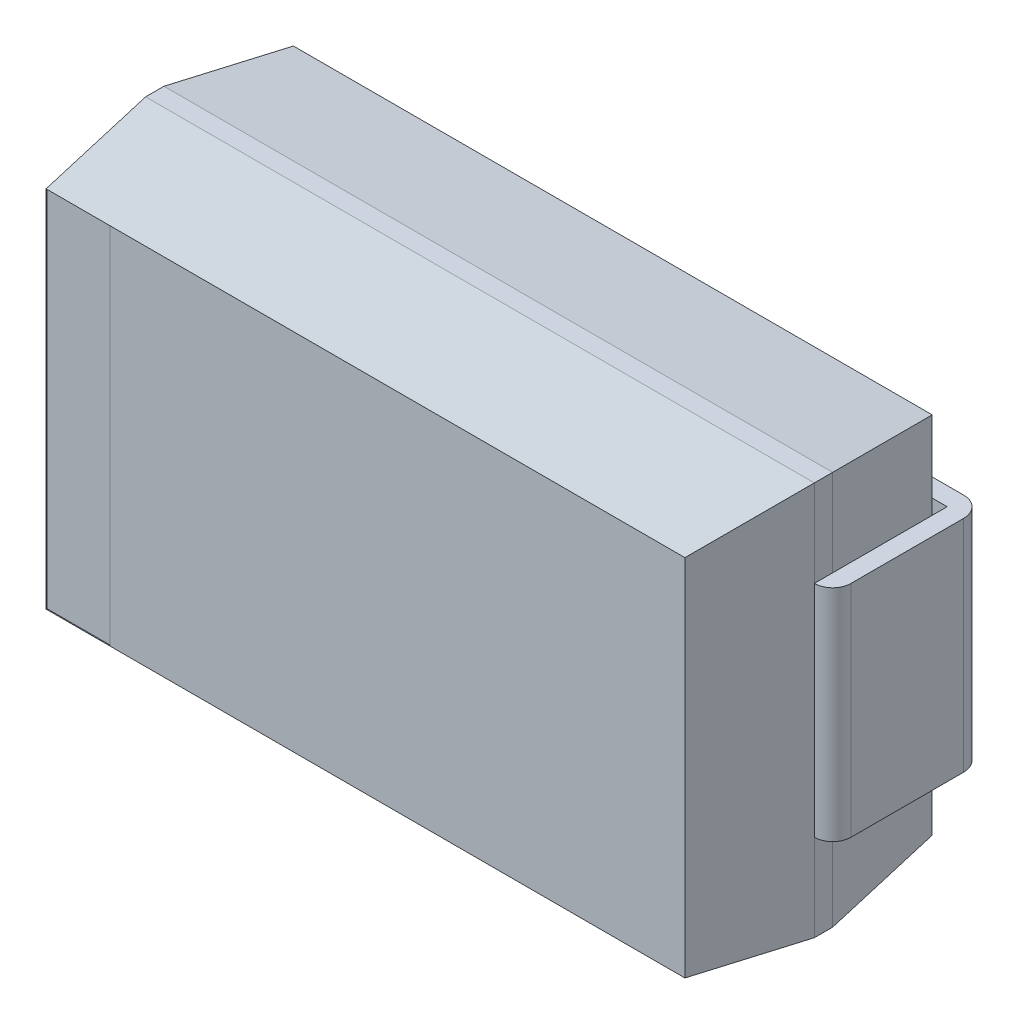
ISO-10303-21;
HEADER;
FILE_DESCRIPTION(('STEP AP214'),'2;1');
FILE_NAME('part.step','',(''),(''),'','','');
FILE_SCHEMA(('AUTOMOTIVE_DESIGN { 1 0 10303 214 1 1 1 1 }'));
ENDSEC;
DATA;
#1=APPLICATION_CONTEXT('core data for automotive mechanical design processes');
#2=APPLICATION_PROTOCOL_DEFINITION('international standard','automotive_design',2000,#1);
#3=PRODUCT_CONTEXT('',#1,'mechanical');
#4=PRODUCT('Part','Part','',(#3));
#5=PRODUCT_RELATED_PRODUCT_CATEGORY('part','',(#4));
#6=PRODUCT_DEFINITION_FORMATION('','',#4);
#7=PRODUCT_DEFINITION_CONTEXT('part definition',#1,'design');
#8=PRODUCT_DEFINITION('design','',#6,#7);
#9=PRODUCT_DEFINITION_SHAPE('','',#8);
#10=(LENGTH_UNIT() NAMED_UNIT(*) SI_UNIT(.MILLI.,.METRE.));
#11=(NAMED_UNIT(*) PLANE_ANGLE_UNIT() SI_UNIT($,.RADIAN.));
#12=(NAMED_UNIT(*) SI_UNIT($,.STERADIAN.) SOLID_ANGLE_UNIT());
#13=UNCERTAINTY_MEASURE_WITH_UNIT(LENGTH_MEASURE(1.E-05),#10,'distance_accuracy_value','');
#14=(GEOMETRIC_REPRESENTATION_CONTEXT(3) GLOBAL_UNCERTAINTY_ASSIGNED_CONTEXT((#13)) GLOBAL_UNIT_ASSIGNED_CONTEXT((#10,
#11,#12)) REPRESENTATION_CONTEXT('',''));
#15=CARTESIAN_POINT('',(0.,0.,0.));
#16=DIRECTION('',(0.,0.,1.));
#17=DIRECTION('',(1.,0.,0.));
#18=AXIS2_PLACEMENT_3D('',#15,#16,#17);
#19=CARTESIAN_POINT('',(2.55,-1.2,0.));
#20=DIRECTION('',(-1.,0.,0.));
#21=DIRECTION('',(0.,0.,-1.));
#22=AXIS2_PLACEMENT_3D('',#19,#20,#21);
#23=PLANE('',#22);
#24=DIRECTION('',(0.,1.,0.));
#25=VECTOR('',#24,1.);
#26=CARTESIAN_POINT('',(2.55,-1.2,0.));
#27=LINE('',#26,#25);
#28=CARTESIAN_POINT('',(2.55,-1.2,0.));
#29=VERTEX_POINT('',#28);
#30=CARTESIAN_POINT('',(2.55,1.2,0.));
#31=VERTEX_POINT('',#30);
#32=EDGE_CURVE('E53',#29,#31,#27,.T.);
#33=ORIENTED_EDGE('',*,*,#32,.F.);
#34=DIRECTION('',(0.,0.,-1.));
#35=VECTOR('',#34,1.);
#36=CARTESIAN_POINT('',(2.55,-1.2,0.));
#37=LINE('',#36,#35);
#38=CARTESIAN_POINT('',(2.55,-1.2,0.2));
#39=VERTEX_POINT('',#38);
#40=EDGE_CURVE('E166',#39,#29,#37,.T.);
#41=ORIENTED_EDGE('',*,*,#40,.F.);
#42=DIRECTION('',(0.,1.,0.));
#43=VECTOR('',#42,1.);
#44=CARTESIAN_POINT('',(2.55,-1.2,0.2));
#45=LINE('',#44,#43);
#46=CARTESIAN_POINT('',(2.55,1.2,0.2));
#47=VERTEX_POINT('',#46);
#48=EDGE_CURVE('E12',#39,#47,#45,.T.);
#49=ORIENTED_EDGE('',*,*,#48,.T.);
#50=DIRECTION('',(0.,0.,-1.));
#51=VECTOR('',#50,1.);
#52=CARTESIAN_POINT('',(2.55,1.2,0.));
#53=LINE('',#52,#51);
#54=EDGE_CURVE('E114',#47,#31,#53,.T.);
#55=ORIENTED_EDGE('',*,*,#54,.T.);
#56=EDGE_LOOP('',(#33,#41,#49,#55));
#57=FACE_BOUND('',#56,.T.);
#58=ADVANCED_FACE('F50',(#57),#23,.T.);
#59=CARTESIAN_POINT('',(2.55,-1.2,0.2));
#60=DIRECTION('',(0.,0.,1.));
#61=DIRECTION('',(-1.,0.,0.));
#62=AXIS2_PLACEMENT_3D('',#59,#60,#61);
#63=PLANE('',#62);
#64=ORIENTED_EDGE('',*,*,#48,.F.);
#65=DIRECTION('',(-1.,0.,0.));
#66=VECTOR('',#65,1.);
#67=CARTESIAN_POINT('',(2.55,-1.2,0.2));
#68=LINE('',#67,#66);
#69=CARTESIAN_POINT('',(3.65,-1.2,0.2));
#70=VERTEX_POINT('',#69);
#71=EDGE_CURVE('E66',#70,#39,#68,.T.);
#72=ORIENTED_EDGE('',*,*,#71,.F.);
#73=DIRECTION('',(0.,1.,0.));
#74=VECTOR('',#73,1.);
#75=CARTESIAN_POINT('',(3.65,-1.2,0.2));
#76=LINE('',#75,#74);
#77=CARTESIAN_POINT('',(3.65,1.2,0.2));
#78=VERTEX_POINT('',#77);
#79=EDGE_CURVE('E58',#70,#78,#76,.T.);
#80=ORIENTED_EDGE('',*,*,#79,.T.);
#81=DIRECTION('',(-1.,0.,0.));
#82=VECTOR('',#81,1.);
#83=CARTESIAN_POINT('',(2.55,1.2,0.2));
#84=LINE('',#83,#82);
#85=EDGE_CURVE('E164',#78,#47,#84,.T.);
#86=ORIENTED_EDGE('',*,*,#85,.T.);
#87=EDGE_LOOP('',(#64,#72,#80,#86));
#88=FACE_BOUND('',#87,.T.);
#89=ADVANCED_FACE('F178',(#88),#63,.T.);
#90=CARTESIAN_POINT('',(3.65,-1.2,0.2));
#91=DIRECTION('',(-1.,0.,0.));
#92=DIRECTION('',(0.,0.,-1.));
#93=AXIS2_PLACEMENT_3D('',#90,#91,#92);
#94=PLANE('',#93);
#95=ORIENTED_EDGE('',*,*,#79,.F.);
#96=DIRECTION('',(0.,0.,-1.));
#97=VECTOR('',#96,1.);
#98=CARTESIAN_POINT('',(3.65,-1.2,1.45000000000003));
#99=LINE('',#98,#97);
#100=CARTESIAN_POINT('',(3.65,-1.2,1.65000000000003));
#101=VERTEX_POINT('',#100);
#102=EDGE_CURVE('E71',#101,#70,#99,.T.);
#103=ORIENTED_EDGE('',*,*,#102,.F.);
#104=DIRECTION('',(0.,1.,0.));
#105=VECTOR('',#104,1.);
#106=CARTESIAN_POINT('',(3.65,-1.2,1.65000000000003));
#107=LINE('',#106,#105);
#108=CARTESIAN_POINT('',(3.65,1.2,1.65000000000003));
#109=VERTEX_POINT('',#108);
#110=EDGE_CURVE('E137',#101,#109,#107,.T.);
#111=ORIENTED_EDGE('',*,*,#110,.T.);
#112=DIRECTION('',(0.,0.,-1.));
#113=VECTOR('',#112,1.);
#114=CARTESIAN_POINT('',(3.65,1.2,1.45000000000003));
#115=LINE('',#114,#113);
#116=EDGE_CURVE('E160',#109,#78,#115,.T.);
#117=ORIENTED_EDGE('',*,*,#116,.T.);
#118=EDGE_LOOP('',(#95,#103,#111,#117));
#119=FACE_BOUND('',#118,.T.);
#120=ADVANCED_FACE('F176',(#119),#94,.T.);
#121=CARTESIAN_POINT('',(3.65,-1.2,1.45000000000003));
#122=DIRECTION('',(0.,1.,0.));
#123=DIRECTION('',(0.,0.,1.));
#124=AXIS2_PLACEMENT_3D('',#121,#122,#123);
#125=CYLINDRICAL_SURFACE('',#124,0.2);
#126=ORIENTED_EDGE('',*,*,#110,.F.);
#127=CARTESIAN_POINT('',(3.65,-1.2,1.45000000000003));
#128=DIRECTION('',(0.,-1.,0.));
#129=DIRECTION('',(0.,0.,-1.));
#130=AXIS2_PLACEMENT_3D('',#127,#128,#129);
#131=CIRCLE('',#130,0.2);
#132=CARTESIAN_POINT('',(3.85,-1.2,1.45000000000003));
#133=VERTEX_POINT('',#132);
#134=EDGE_CURVE('E131',#133,#101,#131,.T.);
#135=ORIENTED_EDGE('',*,*,#134,.F.);
#136=DIRECTION('',(0.,1.,0.));
#137=VECTOR('',#136,1.);
#138=CARTESIAN_POINT('',(3.85,-1.2,1.45000000000003));
#139=LINE('',#138,#137);
#140=CARTESIAN_POINT('',(3.85,1.2,1.45000000000003));
#141=VERTEX_POINT('',#140);
#142=EDGE_CURVE('E140',#133,#141,#139,.T.);
#143=ORIENTED_EDGE('',*,*,#142,.T.);
#144=CARTESIAN_POINT('',(3.65,1.2,1.45000000000003));
#145=DIRECTION('',(0.,-1.,0.));
#146=DIRECTION('',(0.,0.,-1.));
#147=AXIS2_PLACEMENT_3D('',#144,#145,#146);
#148=CIRCLE('',#147,0.2);
#149=EDGE_CURVE('E158',#141,#109,#148,.T.);
#150=ORIENTED_EDGE('',*,*,#149,.T.);
#151=EDGE_LOOP('',(#126,#135,#143,#150));
#152=FACE_BOUND('',#151,.T.);
#153=ADVANCED_FACE('F174',(#152),#125,.T.);
#154=CARTESIAN_POINT('',(3.85,-1.2,1.45000000000003));
#155=DIRECTION('',(1.,0.,0.));
#156=DIRECTION('',(0.,0.,1.));
#157=AXIS2_PLACEMENT_3D('',#154,#155,#156);
#158=PLANE('',#157);
#159=ORIENTED_EDGE('',*,*,#142,.F.);
#160=DIRECTION('',(0.,0.,1.));
#161=VECTOR('',#160,1.);
#162=CARTESIAN_POINT('',(3.85,-1.2,1.45000000000003));
#163=LINE('',#162,#161);
#164=CARTESIAN_POINT('',(3.85,-1.2,0.22));
#165=VERTEX_POINT('',#164);
#166=EDGE_CURVE('E151',#165,#133,#163,.T.);
#167=ORIENTED_EDGE('',*,*,#166,.F.);
#168=DIRECTION('',(0.,1.,0.));
#169=VECTOR('',#168,1.);
#170=CARTESIAN_POINT('',(3.85,-1.2,0.22));
#171=LINE('',#170,#169);
#172=CARTESIAN_POINT('',(3.85,1.2,0.22));
#173=VERTEX_POINT('',#172);
#174=EDGE_CURVE('E129',#165,#173,#171,.T.);
#175=ORIENTED_EDGE('',*,*,#174,.T.);
#176=DIRECTION('',(0.,0.,1.));
#177=VECTOR('',#176,1.);
#178=CARTESIAN_POINT('',(3.85,1.2,1.45000000000003));
#179=LINE('',#178,#177);
#180=EDGE_CURVE('E149',#173,#141,#179,.T.);
#181=ORIENTED_EDGE('',*,*,#180,.T.);
#182=EDGE_LOOP('',(#159,#167,#175,#181));
#183=FACE_BOUND('',#182,.T.);
#184=ADVANCED_FACE('F148',(#183),#158,.T.);
#185=CARTESIAN_POINT('',(3.63,-1.2,0.22));
#186=DIRECTION('',(0.,1.,0.));
#187=DIRECTION('',(0.,0.,1.));
#188=AXIS2_PLACEMENT_3D('',#185,#186,#187);
#189=CYLINDRICAL_SURFACE('',#188,0.22);
#190=ORIENTED_EDGE('',*,*,#174,.F.);
#191=CARTESIAN_POINT('',(3.63,-1.2,0.22));
#192=DIRECTION('',(0.,-1.,0.));
#193=DIRECTION('',(0.,0.,1.));
#194=AXIS2_PLACEMENT_3D('',#191,#192,#193);
#195=CIRCLE('',#194,0.22);
#196=CARTESIAN_POINT('',(3.63,-1.2,0.));
#197=VERTEX_POINT('',#196);
#198=EDGE_CURVE('E155',#197,#165,#195,.T.);
#199=ORIENTED_EDGE('',*,*,#198,.F.);
#200=DIRECTION('',(0.,1.,0.));
#201=VECTOR('',#200,1.);
#202=CARTESIAN_POINT('',(3.63,-1.2,0.));
#203=LINE('',#202,#201);
#204=CARTESIAN_POINT('',(3.63,1.2,0.));
#205=VERTEX_POINT('',#204);
#206=EDGE_CURVE('E128',#197,#205,#203,.T.);
#207=ORIENTED_EDGE('',*,*,#206,.T.);
#208=CARTESIAN_POINT('',(3.63,1.2,0.22));
#209=DIRECTION('',(0.,-1.,0.));
#210=DIRECTION('',(0.,0.,1.));
#211=AXIS2_PLACEMENT_3D('',#208,#209,#210);
#212=CIRCLE('',#211,0.22);
#213=EDGE_CURVE('E116',#205,#173,#212,.T.);
#214=ORIENTED_EDGE('',*,*,#213,.T.);
#215=EDGE_LOOP('',(#190,#199,#207,#214));
#216=FACE_BOUND('',#215,.T.);
#217=ADVANCED_FACE('F154',(#216),#189,.T.);
#218=CARTESIAN_POINT('',(2.55,-1.2,0.));
#219=DIRECTION('',(0.,0.,-1.));
#220=DIRECTION('',(1.,0.,0.));
#221=AXIS2_PLACEMENT_3D('',#218,#219,#220);
#222=PLANE('',#221);
#223=ORIENTED_EDGE('',*,*,#206,.F.);
#224=DIRECTION('',(1.,0.,0.));
#225=VECTOR('',#224,1.);
#226=CARTESIAN_POINT('',(2.55,-1.2,0.));
#227=LINE('',#226,#225);
#228=EDGE_CURVE('E127',#29,#197,#227,.T.);
#229=ORIENTED_EDGE('',*,*,#228,.F.);
#230=ORIENTED_EDGE('',*,*,#32,.T.);
#231=DIRECTION('',(1.,0.,0.));
#232=VECTOR('',#231,1.);
#233=CARTESIAN_POINT('',(2.55,1.2,0.));
#234=LINE('',#233,#232);
#235=EDGE_CURVE('E110',#31,#205,#234,.T.);
#236=ORIENTED_EDGE('',*,*,#235,.T.);
#237=EDGE_LOOP('',(#223,#229,#230,#236));
#238=FACE_BOUND('',#237,.T.);
#239=ADVANCED_FACE('F126',(#238),#222,.T.);
#240=CARTESIAN_POINT('',(3.65,-1.2,1.45000000000003));
#241=DIRECTION('',(0.,-1.,0.));
#242=DIRECTION('',(0.,0.,-1.));
#243=AXIS2_PLACEMENT_3D('',#240,#241,#242);
#244=PLANE('',#243);
#245=ORIENTED_EDGE('',*,*,#40,.T.);
#246=ORIENTED_EDGE('',*,*,#228,.T.);
#247=ORIENTED_EDGE('',*,*,#198,.T.);
#248=ORIENTED_EDGE('',*,*,#166,.T.);
#249=ORIENTED_EDGE('',*,*,#134,.T.);
#250=ORIENTED_EDGE('',*,*,#102,.T.);
#251=ORIENTED_EDGE('',*,*,#71,.T.);
#252=EDGE_LOOP('',(#245,#246,#247,#248,#249,#250,#251));
#253=FACE_BOUND('',#252,.T.);
#254=ADVANCED_FACE('F172',(#253),#244,.T.);
#255=CARTESIAN_POINT('',(3.65,1.2,1.45000000000003));
#256=DIRECTION('',(0.,-1.,0.));
#257=DIRECTION('',(0.,0.,-1.));
#258=AXIS2_PLACEMENT_3D('',#255,#256,#257);
#259=PLANE('',#258);
#260=ORIENTED_EDGE('',*,*,#54,.F.);
#261=ORIENTED_EDGE('',*,*,#85,.F.);
#262=ORIENTED_EDGE('',*,*,#116,.F.);
#263=ORIENTED_EDGE('',*,*,#149,.F.);
#264=ORIENTED_EDGE('',*,*,#180,.F.);
#265=ORIENTED_EDGE('',*,*,#213,.F.);
#266=ORIENTED_EDGE('',*,*,#235,.F.);
#267=EDGE_LOOP('',(#260,#261,#262,#263,#264,#265,#266));
#268=FACE_BOUND('',#267,.T.);
#269=ADVANCED_FACE('F112',(#268),#259,.F.);
#270=CLOSED_SHELL('',(#58,#89,#120,#153,#184,#217,#239,#254,#269));
#271=MANIFOLD_SOLID_BREP('B2',#270);
#272=CARTESIAN_POINT('',(-2.55,-1.2,0.));
#273=DIRECTION('',(1.,0.,0.));
#274=DIRECTION('',(0.,0.,-1.));
#275=AXIS2_PLACEMENT_3D('',#272,#273,#274);
#276=PLANE('',#275);
#277=DIRECTION('',(0.,1.,0.));
#278=VECTOR('',#277,1.);
#279=CARTESIAN_POINT('',(-2.55,-1.2,0.));
#280=LINE('',#279,#278);
#281=CARTESIAN_POINT('',(-2.55,-1.2,0.));
#282=VERTEX_POINT('',#281);
#283=CARTESIAN_POINT('',(-2.55,1.2,0.));
#284=VERTEX_POINT('',#283);
#285=EDGE_CURVE('E285',#282,#284,#280,.T.);
#286=ORIENTED_EDGE('',*,*,#285,.T.);
#287=DIRECTION('',(0.,0.,-1.));
#288=VECTOR('',#287,1.);
#289=CARTESIAN_POINT('',(-2.55,1.2,0.));
#290=LINE('',#289,#288);
#291=CARTESIAN_POINT('',(-2.55,1.2,0.2));
#292=VERTEX_POINT('',#291);
#293=EDGE_CURVE('E340',#292,#284,#290,.T.);
#294=ORIENTED_EDGE('',*,*,#293,.F.);
#295=DIRECTION('',(0.,1.,0.));
#296=VECTOR('',#295,1.);
#297=CARTESIAN_POINT('',(-2.55,-1.2,0.2));
#298=LINE('',#297,#296);
#299=CARTESIAN_POINT('',(-2.55,-1.2,0.2));
#300=VERTEX_POINT('',#299);
#301=EDGE_CURVE('E48',#300,#292,#298,.T.);
#302=ORIENTED_EDGE('',*,*,#301,.F.);
#303=DIRECTION('',(0.,0.,-1.));
#304=VECTOR('',#303,1.);
#305=CARTESIAN_POINT('',(-2.55,-1.2,0.));
#306=LINE('',#305,#304);
#307=EDGE_CURVE('E341',#300,#282,#306,.T.);
#308=ORIENTED_EDGE('',*,*,#307,.T.);
#309=EDGE_LOOP('',(#286,#294,#302,#308));
#310=FACE_BOUND('',#309,.T.);
#311=ADVANCED_FACE('F282',(#310),#276,.T.);
#312=CARTESIAN_POINT('',(-2.55,-1.2,0.2));
#313=DIRECTION('',(0.,0.,1.));
#314=DIRECTION('',(1.,0.,0.));
#315=AXIS2_PLACEMENT_3D('',#312,#313,#314);
#316=PLANE('',#315);
#317=ORIENTED_EDGE('',*,*,#301,.T.);
#318=DIRECTION('',(1.,0.,0.));
#319=VECTOR('',#318,1.);
#320=CARTESIAN_POINT('',(-2.55,1.2,0.2));
#321=LINE('',#320,#319);
#322=CARTESIAN_POINT('',(-3.65,1.2,0.2));
#323=VERTEX_POINT('',#322);
#324=EDGE_CURVE('E359',#323,#292,#321,.T.);
#325=ORIENTED_EDGE('',*,*,#324,.F.);
#326=DIRECTION('',(0.,1.,0.));
#327=VECTOR('',#326,1.);
#328=CARTESIAN_POINT('',(-3.65,-1.2,0.2));
#329=LINE('',#328,#327);
#330=CARTESIAN_POINT('',(-3.65,-1.2,0.2));
#331=VERTEX_POINT('',#330);
#332=EDGE_CURVE('E290',#331,#323,#329,.T.);
#333=ORIENTED_EDGE('',*,*,#332,.F.);
#334=DIRECTION('',(1.,0.,0.));
#335=VECTOR('',#334,1.);
#336=CARTESIAN_POINT('',(-2.55,-1.2,0.2));
#337=LINE('',#336,#335);
#338=EDGE_CURVE('E346',#331,#300,#337,.T.);
#339=ORIENTED_EDGE('',*,*,#338,.T.);
#340=EDGE_LOOP('',(#317,#325,#333,#339));
#341=FACE_BOUND('',#340,.T.);
#342=ADVANCED_FACE('F408',(#341),#316,.T.);
#343=CARTESIAN_POINT('',(-3.65,-1.2,0.2));
#344=DIRECTION('',(1.,0.,0.));
#345=DIRECTION('',(0.,0.,-1.));
#346=AXIS2_PLACEMENT_3D('',#343,#344,#345);
#347=PLANE('',#346);
#348=ORIENTED_EDGE('',*,*,#332,.T.);
#349=DIRECTION('',(0.,0.,-1.));
#350=VECTOR('',#349,1.);
#351=CARTESIAN_POINT('',(-3.65,1.2,1.45000000000003));
#352=LINE('',#351,#350);
#353=CARTESIAN_POINT('',(-3.65,1.2,1.65000000000003));
#354=VERTEX_POINT('',#353);
#355=EDGE_CURVE('E369',#354,#323,#352,.T.);
#356=ORIENTED_EDGE('',*,*,#355,.F.);
#357=DIRECTION('',(0.,1.,0.));
#358=VECTOR('',#357,1.);
#359=CARTESIAN_POINT('',(-3.65,-1.2,1.65000000000003));
#360=LINE('',#359,#358);
#361=CARTESIAN_POINT('',(-3.65,-1.2,1.65000000000003));
#362=VERTEX_POINT('',#361);
#363=EDGE_CURVE('E388',#362,#354,#360,.T.);
#364=ORIENTED_EDGE('',*,*,#363,.F.);
#365=DIRECTION('',(0.,0.,-1.));
#366=VECTOR('',#365,1.);
#367=CARTESIAN_POINT('',(-3.65,-1.2,1.45000000000003));
#368=LINE('',#367,#366);
#369=EDGE_CURVE('E304',#362,#331,#368,.T.);
#370=ORIENTED_EDGE('',*,*,#369,.T.);
#371=EDGE_LOOP('',(#348,#356,#364,#370));
#372=FACE_BOUND('',#371,.T.);
#373=ADVANCED_FACE('F410',(#372),#347,.T.);
#374=CARTESIAN_POINT('',(-3.65,-1.2,1.45000000000003));
#375=DIRECTION('',(0.,1.,0.));
#376=DIRECTION('',(0.,0.,1.));
#377=AXIS2_PLACEMENT_3D('',#374,#375,#376);
#378=CYLINDRICAL_SURFACE('',#377,0.2);
#379=ORIENTED_EDGE('',*,*,#363,.T.);
#380=CARTESIAN_POINT('',(-3.65,1.2,1.45000000000003));
#381=DIRECTION('',(0.,1.,0.));
#382=DIRECTION('',(0.,0.,-1.));
#383=AXIS2_PLACEMENT_3D('',#380,#381,#382);
#384=CIRCLE('',#383,0.2);
#385=CARTESIAN_POINT('',(-3.85,1.2,1.45000000000003));
#386=VERTEX_POINT('',#385);
#387=EDGE_CURVE('E366',#386,#354,#384,.T.);
#388=ORIENTED_EDGE('',*,*,#387,.F.);
#389=DIRECTION('',(0.,1.,0.));
#390=VECTOR('',#389,1.);
#391=CARTESIAN_POINT('',(-3.85,-1.2,1.45000000000003));
#392=LINE('',#391,#390);
#393=CARTESIAN_POINT('',(-3.85,-1.2,1.45000000000003));
#394=VERTEX_POINT('',#393);
#395=EDGE_CURVE('E390',#394,#386,#392,.T.);
#396=ORIENTED_EDGE('',*,*,#395,.F.);
#397=CARTESIAN_POINT('',(-3.65,-1.2,1.45000000000003));
#398=DIRECTION('',(0.,1.,0.));
#399=DIRECTION('',(0.,0.,-1.));
#400=AXIS2_PLACEMENT_3D('',#397,#398,#399);
#401=CIRCLE('',#400,0.2);
#402=EDGE_CURVE('E381',#394,#362,#401,.T.);
#403=ORIENTED_EDGE('',*,*,#402,.T.);
#404=EDGE_LOOP('',(#379,#388,#396,#403));
#405=FACE_BOUND('',#404,.T.);
#406=ADVANCED_FACE('F403',(#405),#378,.T.);
#407=CARTESIAN_POINT('',(-3.85,-1.2,1.45000000000003));
#408=DIRECTION('',(-1.,0.,0.));
#409=DIRECTION('',(0.,0.,1.));
#410=AXIS2_PLACEMENT_3D('',#407,#408,#409);
#411=PLANE('',#410);
#412=ORIENTED_EDGE('',*,*,#395,.T.);
#413=DIRECTION('',(0.,0.,1.));
#414=VECTOR('',#413,1.);
#415=CARTESIAN_POINT('',(-3.85,1.2,1.45000000000003));
#416=LINE('',#415,#414);
#417=CARTESIAN_POINT('',(-3.85,1.2,0.22));
#418=VERTEX_POINT('',#417);
#419=EDGE_CURVE('E363',#418,#386,#416,.T.);
#420=ORIENTED_EDGE('',*,*,#419,.F.);
#421=DIRECTION('',(0.,1.,0.));
#422=VECTOR('',#421,1.);
#423=CARTESIAN_POINT('',(-3.85,-1.2,0.22));
#424=LINE('',#423,#422);
#425=CARTESIAN_POINT('',(-3.85,-1.2,0.22));
#426=VERTEX_POINT('',#425);
#427=EDGE_CURVE('E392',#426,#418,#424,.T.);
#428=ORIENTED_EDGE('',*,*,#427,.F.);
#429=DIRECTION('',(0.,0.,1.));
#430=VECTOR('',#429,1.);
#431=CARTESIAN_POINT('',(-3.85,-1.2,1.45000000000003));
#432=LINE('',#431,#430);
#433=EDGE_CURVE('E378',#426,#394,#432,.T.);
#434=ORIENTED_EDGE('',*,*,#433,.T.);
#435=EDGE_LOOP('',(#412,#420,#428,#434));
#436=FACE_BOUND('',#435,.T.);
#437=ADVANCED_FACE('F400',(#436),#411,.T.);
#438=CARTESIAN_POINT('',(-3.63,-1.2,0.22));
#439=DIRECTION('',(0.,1.,0.));
#440=DIRECTION('',(0.,0.,1.));
#441=AXIS2_PLACEMENT_3D('',#438,#439,#440);
#442=CYLINDRICAL_SURFACE('',#441,0.22);
#443=ORIENTED_EDGE('',*,*,#427,.T.);
#444=CARTESIAN_POINT('',(-3.63,1.2,0.22));
#445=DIRECTION('',(0.,1.,0.));
#446=DIRECTION('',(0.,0.,1.));
#447=AXIS2_PLACEMENT_3D('',#444,#445,#446);
#448=CIRCLE('',#447,0.22);
#449=CARTESIAN_POINT('',(-3.63,1.2,0.));
#450=VERTEX_POINT('',#449);
#451=EDGE_CURVE('E353',#450,#418,#448,.T.);
#452=ORIENTED_EDGE('',*,*,#451,.F.);
#453=DIRECTION('',(0.,1.,0.));
#454=VECTOR('',#453,1.);
#455=CARTESIAN_POINT('',(-3.63,-1.2,0.));
#456=LINE('',#455,#454);
#457=CARTESIAN_POINT('',(-3.63,-1.2,0.));
#458=VERTEX_POINT('',#457);
#459=EDGE_CURVE('E345',#458,#450,#456,.T.);
#460=ORIENTED_EDGE('',*,*,#459,.F.);
#461=CARTESIAN_POINT('',(-3.63,-1.2,0.22));
#462=DIRECTION('',(0.,1.,0.));
#463=DIRECTION('',(0.,0.,1.));
#464=AXIS2_PLACEMENT_3D('',#461,#462,#463);
#465=CIRCLE('',#464,0.22);
#466=EDGE_CURVE('E375',#458,#426,#465,.T.);
#467=ORIENTED_EDGE('',*,*,#466,.T.);
#468=EDGE_LOOP('',(#443,#452,#460,#467));
#469=FACE_BOUND('',#468,.T.);
#470=ADVANCED_FACE('F394',(#469),#442,.T.);
#471=CARTESIAN_POINT('',(-2.55,-1.2,0.));
#472=DIRECTION('',(0.,0.,-1.));
#473=DIRECTION('',(-1.,0.,0.));
#474=AXIS2_PLACEMENT_3D('',#471,#472,#473);
#475=PLANE('',#474);
#476=ORIENTED_EDGE('',*,*,#459,.T.);
#477=DIRECTION('',(-1.,0.,0.));
#478=VECTOR('',#477,1.);
#479=CARTESIAN_POINT('',(-2.55,1.2,0.));
#480=LINE('',#479,#478);
#481=EDGE_CURVE('E348',#284,#450,#480,.T.);
#482=ORIENTED_EDGE('',*,*,#481,.F.);
#483=ORIENTED_EDGE('',*,*,#285,.F.);
#484=DIRECTION('',(-1.,0.,0.));
#485=VECTOR('',#484,1.);
#486=CARTESIAN_POINT('',(-2.55,-1.2,0.));
#487=LINE('',#486,#485);
#488=EDGE_CURVE('E373',#282,#458,#487,.T.);
#489=ORIENTED_EDGE('',*,*,#488,.T.);
#490=EDGE_LOOP('',(#476,#482,#483,#489));
#491=FACE_BOUND('',#490,.T.);
#492=ADVANCED_FACE('F349',(#491),#475,.T.);
#493=CARTESIAN_POINT('',(-3.65,-1.2,1.45000000000003));
#494=DIRECTION('',(0.,-1.,0.));
#495=DIRECTION('',(0.,0.,-1.));
#496=AXIS2_PLACEMENT_3D('',#493,#494,#495);
#497=PLANE('',#496);
#498=ORIENTED_EDGE('',*,*,#307,.F.);
#499=ORIENTED_EDGE('',*,*,#338,.F.);
#500=ORIENTED_EDGE('',*,*,#369,.F.);
#501=ORIENTED_EDGE('',*,*,#402,.F.);
#502=ORIENTED_EDGE('',*,*,#433,.F.);
#503=ORIENTED_EDGE('',*,*,#466,.F.);
#504=ORIENTED_EDGE('',*,*,#488,.F.);
#505=EDGE_LOOP('',(#498,#499,#500,#501,#502,#503,#504));
#506=FACE_BOUND('',#505,.T.);
#507=ADVANCED_FACE('F405',(#506),#497,.T.);
#508=CARTESIAN_POINT('',(-3.65,1.2,1.45000000000003));
#509=DIRECTION('',(0.,-1.,0.));
#510=DIRECTION('',(0.,0.,-1.));
#511=AXIS2_PLACEMENT_3D('',#508,#509,#510);
#512=PLANE('',#511);
#513=ORIENTED_EDGE('',*,*,#293,.T.);
#514=ORIENTED_EDGE('',*,*,#481,.T.);
#515=ORIENTED_EDGE('',*,*,#451,.T.);
#516=ORIENTED_EDGE('',*,*,#419,.T.);
#517=ORIENTED_EDGE('',*,*,#387,.T.);
#518=ORIENTED_EDGE('',*,*,#355,.T.);
#519=ORIENTED_EDGE('',*,*,#324,.T.);
#520=EDGE_LOOP('',(#513,#514,#515,#516,#517,#518,#519));
#521=FACE_BOUND('',#520,.T.);
#522=ADVANCED_FACE('F356',(#521),#512,.F.);
#523=CLOSED_SHELL('',(#311,#342,#373,#406,#437,#470,#492,#507,#522));
#524=MANIFOLD_SOLID_BREP('B6',#523);
#525=CARTESIAN_POINT('',(3.65,2.15,2.9));
#526=DIRECTION('',(-1.,0.,0.));
#527=DIRECTION('',(0.,-1.,0.));
#528=AXIS2_PLACEMENT_3D('',#525,#526,#527);
#529=PLANE('',#528);
#530=DIRECTION('',(0.,0.,-1.));
#531=VECTOR('',#530,1.);
#532=CARTESIAN_POINT('',(3.65,-2.15,2.9));
#533=LINE('',#532,#531);
#534=CARTESIAN_POINT('',(3.65,-2.15,1.64999999999996));
#535=VERTEX_POINT('',#534);
#536=CARTESIAN_POINT('',(3.65,-2.15,1.45000000000003));
#537=VERTEX_POINT('',#536);
#538=EDGE_CURVE('E610',#535,#537,#533,.T.);
#539=ORIENTED_EDGE('',*,*,#538,.T.);
#540=DIRECTION('',(0.,1.,0.));
#541=VECTOR('',#540,1.);
#542=CARTESIAN_POINT('',(3.65,2.15,1.45000000000003));
#543=LINE('',#542,#541);
#544=CARTESIAN_POINT('',(3.65,2.15,1.45000000000003));
#545=VERTEX_POINT('',#544);
#546=EDGE_CURVE('E639',#537,#545,#543,.T.);
#547=ORIENTED_EDGE('',*,*,#546,.T.);
#548=DIRECTION('',(0.,0.,-1.));
#549=VECTOR('',#548,1.);
#550=CARTESIAN_POINT('',(3.65,2.15,2.9));
#551=LINE('',#550,#549);
#552=CARTESIAN_POINT('',(3.65,2.15,1.64999999999996));
#553=VERTEX_POINT('',#552);
#554=EDGE_CURVE('E618',#553,#545,#551,.T.);
#555=ORIENTED_EDGE('',*,*,#554,.F.);
#556=DIRECTION('',(0.,-1.,0.));
#557=VECTOR('',#556,1.);
#558=CARTESIAN_POINT('',(3.65,-2.15,1.64999999999996));
#559=LINE('',#558,#557);
#560=EDGE_CURVE('E633',#553,#535,#559,.T.);
#561=ORIENTED_EDGE('',*,*,#560,.T.);
#562=EDGE_LOOP('',(#539,#547,#555,#561));
#563=FACE_BOUND('',#562,.T.);
#564=ADVANCED_FACE('F487',(#563),#529,.F.);
#565=CARTESIAN_POINT('',(-3.65,2.15,2.9));
#566=DIRECTION('',(0.,-1.,0.));
#567=DIRECTION('',(0.,0.,-1.));
#568=AXIS2_PLACEMENT_3D('',#565,#566,#567);
#569=PLANE('',#568);
#570=ORIENTED_EDGE('',*,*,#554,.T.);
#571=DIRECTION('',(-1.,0.,0.));
#572=VECTOR('',#571,1.);
#573=CARTESIAN_POINT('',(-3.65,2.15,1.45000000000003));
#574=LINE('',#573,#572);
#575=CARTESIAN_POINT('',(-3.65,2.15,1.45000000000003));
#576=VERTEX_POINT('',#575);
#577=EDGE_CURVE('E661',#545,#576,#574,.T.);
#578=ORIENTED_EDGE('',*,*,#577,.T.);
#579=DIRECTION('',(0.,0.,-1.));
#580=VECTOR('',#579,1.);
#581=CARTESIAN_POINT('',(-3.65,2.15,2.9));
#582=LINE('',#581,#580);
#583=CARTESIAN_POINT('',(-3.65,2.15,1.64999999999996));
#584=VERTEX_POINT('',#583);
#585=EDGE_CURVE('E616',#584,#576,#582,.T.);
#586=ORIENTED_EDGE('',*,*,#585,.F.);
#587=DIRECTION('',(1.,0.,0.));
#588=VECTOR('',#587,1.);
#589=CARTESIAN_POINT('',(3.65,2.15,1.64999999999996));
#590=LINE('',#589,#588);
#591=EDGE_CURVE('E630',#584,#553,#590,.T.);
#592=ORIENTED_EDGE('',*,*,#591,.T.);
#593=EDGE_LOOP('',(#570,#578,#586,#592));
#594=FACE_BOUND('',#593,.T.);
#595=ADVANCED_FACE('F694',(#594),#569,.F.);
#596=CARTESIAN_POINT('',(-3.65,2.15,2.9));
#597=DIRECTION('',(1.,0.,0.));
#598=DIRECTION('',(0.,0.,-1.));
#599=AXIS2_PLACEMENT_3D('',#596,#597,#598);
#600=PLANE('',#599);
#601=ORIENTED_EDGE('',*,*,#585,.T.);
#602=DIRECTION('',(0.,-1.,0.));
#603=VECTOR('',#602,1.);
#604=CARTESIAN_POINT('',(-3.65,2.15,1.45000000000003));
#605=LINE('',#604,#603);
#606=CARTESIAN_POINT('',(-3.65,-2.15,1.45000000000003));
#607=VERTEX_POINT('',#606);
#608=EDGE_CURVE('E280',#576,#607,#605,.T.);
#609=ORIENTED_EDGE('',*,*,#608,.T.);
#610=DIRECTION('',(0.,0.,-1.));
#611=VECTOR('',#610,1.);
#612=CARTESIAN_POINT('',(-3.65,-2.15,2.9));
#613=LINE('',#612,#611);
#614=CARTESIAN_POINT('',(-3.65,-2.15,1.64999999999996));
#615=VERTEX_POINT('',#614);
#616=EDGE_CURVE('E613',#615,#607,#613,.T.);
#617=ORIENTED_EDGE('',*,*,#616,.F.);
#618=DIRECTION('',(0.,1.,0.));
#619=VECTOR('',#618,1.);
#620=CARTESIAN_POINT('',(-3.65,2.15,1.64999999999996));
#621=LINE('',#620,#619);
#622=EDGE_CURVE('E637',#615,#584,#621,.T.);
#623=ORIENTED_EDGE('',*,*,#622,.T.);
#624=EDGE_LOOP('',(#601,#609,#617,#623));
#625=FACE_BOUND('',#624,.T.);
#626=ADVANCED_FACE('F731',(#625),#600,.F.);
#627=CARTESIAN_POINT('',(-3.65,-2.15,2.9));
#628=DIRECTION('',(0.,1.,0.));
#629=DIRECTION('',(0.,0.,1.));
#630=AXIS2_PLACEMENT_3D('',#627,#628,#629);
#631=PLANE('',#630);
#632=ORIENTED_EDGE('',*,*,#616,.T.);
#633=DIRECTION('',(1.,0.,0.));
#634=VECTOR('',#633,1.);
#635=CARTESIAN_POINT('',(-3.65,-2.15,1.45000000000003));
#636=LINE('',#635,#634);
#637=EDGE_CURVE('E496',#607,#537,#636,.T.);
#638=ORIENTED_EDGE('',*,*,#637,.T.);
#639=ORIENTED_EDGE('',*,*,#538,.F.);
#640=DIRECTION('',(-1.,0.,0.));
#641=VECTOR('',#640,1.);
#642=CARTESIAN_POINT('',(-3.65,-2.15,1.64999999999996));
#643=LINE('',#642,#641);
#644=EDGE_CURVE('E635',#535,#615,#643,.T.);
#645=ORIENTED_EDGE('',*,*,#644,.T.);
#646=EDGE_LOOP('',(#632,#638,#639,#645));
#647=FACE_BOUND('',#646,.T.);
#648=ADVANCED_FACE('F784',(#647),#631,.F.);
#649=CARTESIAN_POINT('',(0.,0.,2.9));
#650=DIRECTION('',(0.,0.,1.));
#651=DIRECTION('',(1.,0.,0.));
#652=AXIS2_PLACEMENT_3D('',#649,#650,#651);
#653=PLANE('',#652);
#654=DIRECTION('',(0.,1.,0.));
#655=VECTOR('',#654,1.);
#656=CARTESIAN_POINT('',(-2.787,-1.987,2.9));
#657=LINE('',#656,#655);
#658=CARTESIAN_POINT('',(-2.787,-1.987,2.9));
#659=VERTEX_POINT('',#658);
#660=CARTESIAN_POINT('',(-2.787,1.987,2.9));
#661=VERTEX_POINT('',#660);
#662=EDGE_CURVE('E504',#659,#661,#657,.T.);
#663=ORIENTED_EDGE('',*,*,#662,.F.);
#664=DIRECTION('',(1.,0.,0.));
#665=VECTOR('',#664,1.);
#666=CARTESIAN_POINT('',(3.65,-1.987,2.9));
#667=LINE('',#666,#665);
#668=CARTESIAN_POINT('',(3.487,-1.987,2.9));
#669=VERTEX_POINT('',#668);
#670=EDGE_CURVE('E622',#659,#669,#667,.T.);
#671=ORIENTED_EDGE('',*,*,#670,.T.);
#672=DIRECTION('',(0.,1.,0.));
#673=VECTOR('',#672,1.);
#674=CARTESIAN_POINT('',(3.487,2.15,2.9));
#675=LINE('',#674,#673);
#676=CARTESIAN_POINT('',(3.487,1.987,2.9));
#677=VERTEX_POINT('',#676);
#678=EDGE_CURVE('E625',#669,#677,#675,.T.);
#679=ORIENTED_EDGE('',*,*,#678,.T.);
#680=DIRECTION('',(-1.,0.,0.));
#681=VECTOR('',#680,1.);
#682=CARTESIAN_POINT('',(-3.65,1.987,2.9));
#683=LINE('',#682,#681);
#684=EDGE_CURVE('E627',#677,#661,#683,.T.);
#685=ORIENTED_EDGE('',*,*,#684,.T.);
#686=EDGE_LOOP('',(#663,#671,#679,#685));
#687=FACE_BOUND('',#686,.T.);
#688=ADVANCED_FACE('F713',(#687),#653,.T.);
#689=CARTESIAN_POINT('',(0.,0.,0.2));
#690=DIRECTION('',(0.,0.,1.));
#691=DIRECTION('',(1.,0.,0.));
#692=AXIS2_PLACEMENT_3D('',#689,#690,#691);
#693=PLANE('',#692);
#694=DIRECTION('',(1.,0.,0.));
#695=VECTOR('',#694,1.);
#696=CARTESIAN_POINT('',(0.,1.987,0.2));
#697=LINE('',#696,#695);
#698=CARTESIAN_POINT('',(-3.487,1.987,0.2));
#699=VERTEX_POINT('',#698);
#700=CARTESIAN_POINT('',(3.487,1.987,0.2));
#701=VERTEX_POINT('',#700);
#702=EDGE_CURVE('E656',#699,#701,#697,.T.);
#703=ORIENTED_EDGE('',*,*,#702,.T.);
#704=DIRECTION('',(0.,-1.,0.));
#705=VECTOR('',#704,1.);
#706=CARTESIAN_POINT('',(3.487,0.,0.2));
#707=LINE('',#706,#705);
#708=CARTESIAN_POINT('',(3.487,-1.987,0.2));
#709=VERTEX_POINT('',#708);
#710=EDGE_CURVE('E658',#701,#709,#707,.T.);
#711=ORIENTED_EDGE('',*,*,#710,.T.);
#712=DIRECTION('',(-1.,0.,0.));
#713=VECTOR('',#712,1.);
#714=CARTESIAN_POINT('',(0.,-1.987,0.2));
#715=LINE('',#714,#713);
#716=CARTESIAN_POINT('',(-3.487,-1.987,0.2));
#717=VERTEX_POINT('',#716);
#718=EDGE_CURVE('E654',#709,#717,#715,.T.);
#719=ORIENTED_EDGE('',*,*,#718,.T.);
#720=DIRECTION('',(0.,1.,0.));
#721=VECTOR('',#720,1.);
#722=CARTESIAN_POINT('',(-3.487,0.,0.2));
#723=LINE('',#722,#721);
#724=EDGE_CURVE('E652',#717,#699,#723,.T.);
#725=ORIENTED_EDGE('',*,*,#724,.T.);
#726=EDGE_LOOP('',(#703,#711,#719,#725));
#727=FACE_BOUND('',#726,.T.);
#728=ADVANCED_FACE('F682',(#727),#693,.F.);
#729=CARTESIAN_POINT('',(0.,-1.987,2.9));
#730=DIRECTION('',(0.,-0.991604834122273,0.129305270369541));
#731=DIRECTION('',(-1.,0.,0.));
#732=AXIS2_PLACEMENT_3D('',#729,#730,#731);
#733=PLANE('',#732);
#734=DIRECTION('',(0.128237657070635,0.128237657070635,0.983417615572381));
#735=VECTOR('',#734,1.);
#736=CARTESIAN_POINT('',(-3.45432399027505,-1.95432399027505,3.15058289666373));
#737=LINE('',#736,#735);
#738=CARTESIAN_POINT('',(-3.487,-1.987,2.9));
#739=VERTEX_POINT('',#738);
#740=EDGE_CURVE('E645',#615,#739,#737,.T.);
#741=ORIENTED_EDGE('',*,*,#740,.F.);
#742=ORIENTED_EDGE('',*,*,#644,.F.);
#743=DIRECTION('',(-0.128237657070635,0.128237657070635,0.983417615572381));
#744=VECTOR('',#743,1.);
#745=CARTESIAN_POINT('',(3.4296566452386,-1.9296566452386,3.33974965307822));
#746=LINE('',#745,#744);
#747=EDGE_CURVE('E614',#669,#535,#746,.F.);
#748=ORIENTED_EDGE('',*,*,#747,.F.);
#749=ORIENTED_EDGE('',*,*,#670,.F.);
#750=EDGE_CURVE('E623',#739,#659,#667,.T.);
#751=ORIENTED_EDGE('',*,*,#750,.F.);
#752=EDGE_LOOP('',(#741,#742,#748,#749,#751));
#753=FACE_BOUND('',#752,.T.);
#754=ADVANCED_FACE('F709',(#753),#733,.T.);
#755=CARTESIAN_POINT('',(3.487,0.,2.9));
#756=DIRECTION('',(0.991604834122273,0.,0.129305270369541));
#757=DIRECTION('',(0.,-1.,0.));
#758=AXIS2_PLACEMENT_3D('',#755,#756,#757);
#759=PLANE('',#758);
#760=ORIENTED_EDGE('',*,*,#747,.T.);
#761=ORIENTED_EDGE('',*,*,#560,.F.);
#762=DIRECTION('',(-0.128237657070635,-0.128237657070635,0.983417615572381));
#763=VECTOR('',#762,1.);
#764=CARTESIAN_POINT('',(3.45432399027505,1.95432399027505,3.15058289666373));
#765=LINE('',#764,#763);
#766=EDGE_CURVE('E643',#677,#553,#765,.F.);
#767=ORIENTED_EDGE('',*,*,#766,.F.);
#768=ORIENTED_EDGE('',*,*,#678,.F.);
#769=EDGE_LOOP('',(#760,#761,#767,#768));
#770=FACE_BOUND('',#769,.T.);
#771=ADVANCED_FACE('F739',(#770),#759,.T.);
#772=CARTESIAN_POINT('',(-3.487,0.,2.9));
#773=DIRECTION('',(-0.991604834122273,0.,0.129305270369541));
#774=DIRECTION('',(0.,1.,0.));
#775=AXIS2_PLACEMENT_3D('',#772,#773,#774);
#776=PLANE('',#775);
#777=ORIENTED_EDGE('',*,*,#740,.T.);
#778=DIRECTION('',(0.,-1.,0.));
#779=VECTOR('',#778,1.);
#780=CARTESIAN_POINT('',(-3.487,-2.15,2.9));
#781=LINE('',#780,#779);
#782=CARTESIAN_POINT('',(-3.487,1.987,2.9));
#783=VERTEX_POINT('',#782);
#784=EDGE_CURVE('E579',#783,#739,#781,.T.);
#785=ORIENTED_EDGE('',*,*,#784,.F.);
#786=DIRECTION('',(-0.128237657070635,0.128237657070635,-0.983417615572381));
#787=VECTOR('',#786,1.);
#788=CARTESIAN_POINT('',(-3.45432399027505,1.95432399027505,3.15058289666373));
#789=LINE('',#788,#787);
#790=EDGE_CURVE('E640',#584,#783,#789,.F.);
#791=ORIENTED_EDGE('',*,*,#790,.F.);
#792=ORIENTED_EDGE('',*,*,#622,.F.);
#793=EDGE_LOOP('',(#777,#785,#791,#792));
#794=FACE_BOUND('',#793,.T.);
#795=ADVANCED_FACE('F705',(#794),#776,.T.);
#796=CARTESIAN_POINT('',(0.,1.987,2.9));
#797=DIRECTION('',(0.,0.991604834122273,0.129305270369541));
#798=DIRECTION('',(1.,0.,0.));
#799=AXIS2_PLACEMENT_3D('',#796,#797,#798);
#800=PLANE('',#799);
#801=ORIENTED_EDGE('',*,*,#766,.T.);
#802=ORIENTED_EDGE('',*,*,#591,.F.);
#803=ORIENTED_EDGE('',*,*,#790,.T.);
#804=DIRECTION('',(-1.,0.,0.));
#805=VECTOR('',#804,1.);
#806=CARTESIAN_POINT('',(-3.487,1.987,2.9));
#807=LINE('',#806,#805);
#808=EDGE_CURVE('E596',#661,#783,#807,.T.);
#809=ORIENTED_EDGE('',*,*,#808,.F.);
#810=ORIENTED_EDGE('',*,*,#684,.F.);
#811=EDGE_LOOP('',(#801,#802,#803,#809,#810));
#812=FACE_BOUND('',#811,.T.);
#813=ADVANCED_FACE('F698',(#812),#800,.T.);
#814=CARTESIAN_POINT('',(-3.65,2.15,1.45000000000003));
#815=DIRECTION('',(0.991604834122273,0.,0.129305270369541));
#816=DIRECTION('',(0.,-1.,0.));
#817=AXIS2_PLACEMENT_3D('',#814,#815,#816);
#818=PLANE('',#817);
#819=DIRECTION('',(0.128237657070635,-0.128237657070635,-0.983417615572381));
#820=VECTOR('',#819,1.);
#821=CARTESIAN_POINT('',(-3.65,2.15,1.45000000000003));
#822=LINE('',#821,#820);
#823=EDGE_CURVE('E666',#699,#576,#822,.F.);
#824=ORIENTED_EDGE('',*,*,#823,.F.);
#825=ORIENTED_EDGE('',*,*,#724,.F.);
#826=DIRECTION('',(-0.128237657070635,-0.128237657070635,0.983417615572381));
#827=VECTOR('',#826,1.);
#828=CARTESIAN_POINT('',(-3.57928694422885,-2.07928694422885,0.907721964945162));
#829=LINE('',#828,#827);
#830=EDGE_CURVE('E491',#607,#717,#829,.F.);
#831=ORIENTED_EDGE('',*,*,#830,.F.);
#832=ORIENTED_EDGE('',*,*,#608,.F.);
#833=EDGE_LOOP('',(#824,#825,#831,#832));
#834=FACE_BOUND('',#833,.T.);
#835=ADVANCED_FACE('F489',(#834),#818,.F.);
#836=CARTESIAN_POINT('',(-3.65,-2.15,1.45000000000003));
#837=DIRECTION('',(0.,0.991604834122273,0.129305270369541));
#838=DIRECTION('',(1.,0.,0.));
#839=AXIS2_PLACEMENT_3D('',#836,#837,#838);
#840=PLANE('',#839);
#841=ORIENTED_EDGE('',*,*,#830,.T.);
#842=ORIENTED_EDGE('',*,*,#718,.F.);
#843=DIRECTION('',(0.128237657070635,-0.128237657070635,0.983417615572381));
#844=VECTOR('',#843,1.);
#845=CARTESIAN_POINT('',(3.52995225415595,-2.02995225415595,0.529388452116184));
#846=LINE('',#845,#844);
#847=EDGE_CURVE('E665',#537,#709,#846,.F.);
#848=ORIENTED_EDGE('',*,*,#847,.F.);
#849=ORIENTED_EDGE('',*,*,#637,.F.);
#850=EDGE_LOOP('',(#841,#842,#848,#849));
#851=FACE_BOUND('',#850,.T.);
#852=ADVANCED_FACE('F677',(#851),#840,.F.);
#853=CARTESIAN_POINT('',(-3.65,2.15,1.45000000000003));
#854=DIRECTION('',(0.,-0.991604834122273,0.129305270369541));
#855=DIRECTION('',(-1.,0.,0.));
#856=AXIS2_PLACEMENT_3D('',#853,#854,#855);
#857=PLANE('',#856);
#858=ORIENTED_EDGE('',*,*,#823,.T.);
#859=ORIENTED_EDGE('',*,*,#577,.F.);
#860=DIRECTION('',(-0.128237657070635,-0.128237657070635,-0.983417615572381));
#861=VECTOR('',#860,1.);
#862=CARTESIAN_POINT('',(3.52995225415595,2.02995225415595,0.529388452116184));
#863=LINE('',#862,#861);
#864=EDGE_CURVE('E606',#701,#545,#863,.F.);
#865=ORIENTED_EDGE('',*,*,#864,.F.);
#866=ORIENTED_EDGE('',*,*,#702,.F.);
#867=EDGE_LOOP('',(#858,#859,#865,#866));
#868=FACE_BOUND('',#867,.T.);
#869=ADVANCED_FACE('F688',(#868),#857,.F.);
#870=CARTESIAN_POINT('',(3.65,2.15,1.45000000000003));
#871=DIRECTION('',(-0.991604834122273,0.,0.129305270369541));
#872=DIRECTION('',(0.,1.,0.));
#873=AXIS2_PLACEMENT_3D('',#870,#871,#872);
#874=PLANE('',#873);
#875=ORIENTED_EDGE('',*,*,#847,.T.);
#876=ORIENTED_EDGE('',*,*,#710,.F.);
#877=ORIENTED_EDGE('',*,*,#864,.T.);
#878=ORIENTED_EDGE('',*,*,#546,.F.);
#879=EDGE_LOOP('',(#875,#876,#877,#878));
#880=FACE_BOUND('',#879,.T.);
#881=ADVANCED_FACE('F686',(#880),#874,.F.);
#882=CARTESIAN_POINT('',(-3.487,-1.987,2.89));
#883=DIRECTION('',(-1.,0.,0.));
#884=DIRECTION('',(0.,0.,1.));
#885=AXIS2_PLACEMENT_3D('',#882,#883,#884);
#886=PLANE('',#885);
#887=ORIENTED_EDGE('',*,*,#784,.T.);
#888=DIRECTION('',(0.,0.,1.));
#889=VECTOR('',#888,1.);
#890=CARTESIAN_POINT('',(-3.487,-1.987,2.89));
#891=LINE('',#890,#889);
#892=CARTESIAN_POINT('',(-3.487,-1.987,2.89));
#893=VERTEX_POINT('',#892);
#894=EDGE_CURVE('E572',#893,#739,#891,.T.);
#895=ORIENTED_EDGE('',*,*,#894,.F.);
#896=DIRECTION('',(0.,-1.,0.));
#897=VECTOR('',#896,1.);
#898=CARTESIAN_POINT('',(-3.487,-1.987,2.89));
#899=LINE('',#898,#897);
#900=CARTESIAN_POINT('',(-3.487,1.987,2.89));
#901=VERTEX_POINT('',#900);
#902=EDGE_CURVE('E576',#901,#893,#899,.T.);
#903=ORIENTED_EDGE('',*,*,#902,.F.);
#904=DIRECTION('',(0.,0.,1.));
#905=VECTOR('',#904,1.);
#906=CARTESIAN_POINT('',(-3.487,1.987,2.89));
#907=LINE('',#906,#905);
#908=EDGE_CURVE('E604',#901,#783,#907,.T.);
#909=ORIENTED_EDGE('',*,*,#908,.T.);
#910=EDGE_LOOP('',(#887,#895,#903,#909));
#911=FACE_BOUND('',#910,.T.);
#912=ADVANCED_FACE('F574',(#911),#886,.F.);
#913=CARTESIAN_POINT('',(-3.487,1.987,2.89));
#914=DIRECTION('',(0.,1.,0.));
#915=DIRECTION('',(0.,0.,1.));
#916=AXIS2_PLACEMENT_3D('',#913,#914,#915);
#917=PLANE('',#916);
#918=ORIENTED_EDGE('',*,*,#808,.T.);
#919=ORIENTED_EDGE('',*,*,#908,.F.);
#920=DIRECTION('',(-1.,0.,0.));
#921=VECTOR('',#920,1.);
#922=CARTESIAN_POINT('',(-3.487,1.987,2.89));
#923=LINE('',#922,#921);
#924=CARTESIAN_POINT('',(-2.787,1.987,2.89));
#925=VERTEX_POINT('',#924);
#926=EDGE_CURVE('E584',#925,#901,#923,.T.);
#927=ORIENTED_EDGE('',*,*,#926,.F.);
#928=DIRECTION('',(0.,0.,1.));
#929=VECTOR('',#928,1.);
#930=CARTESIAN_POINT('',(-2.787,1.987,2.89));
#931=LINE('',#930,#929);
#932=EDGE_CURVE('E607',#925,#661,#931,.T.);
#933=ORIENTED_EDGE('',*,*,#932,.T.);
#934=EDGE_LOOP('',(#918,#919,#927,#933));
#935=FACE_BOUND('',#934,.T.);
#936=ADVANCED_FACE('F716',(#935),#917,.F.);
#937=CARTESIAN_POINT('',(-2.787,-1.987,2.89));
#938=DIRECTION('',(1.,0.,0.));
#939=DIRECTION('',(0.,0.,-1.));
#940=AXIS2_PLACEMENT_3D('',#937,#938,#939);
#941=PLANE('',#940);
#942=ORIENTED_EDGE('',*,*,#662,.T.);
#943=ORIENTED_EDGE('',*,*,#932,.F.);
#944=DIRECTION('',(0.,1.,0.));
#945=VECTOR('',#944,1.);
#946=CARTESIAN_POINT('',(-2.787,-1.987,2.89));
#947=LINE('',#946,#945);
#948=CARTESIAN_POINT('',(-2.787,-1.987,2.89));
#949=VERTEX_POINT('',#948);
#950=EDGE_CURVE('E592',#949,#925,#947,.T.);
#951=ORIENTED_EDGE('',*,*,#950,.F.);
#952=DIRECTION('',(0.,0.,1.));
#953=VECTOR('',#952,1.);
#954=CARTESIAN_POINT('',(-2.787,-1.987,2.89));
#955=LINE('',#954,#953);
#956=EDGE_CURVE('E583',#949,#659,#955,.T.);
#957=ORIENTED_EDGE('',*,*,#956,.T.);
#958=EDGE_LOOP('',(#942,#943,#951,#957));
#959=FACE_BOUND('',#958,.T.);
#960=ADVANCED_FACE('F717',(#959),#941,.F.);
#961=CARTESIAN_POINT('',(-3.487,-1.987,2.89));
#962=DIRECTION('',(0.,-1.,0.));
#963=DIRECTION('',(0.,0.,-1.));
#964=AXIS2_PLACEMENT_3D('',#961,#962,#963);
#965=PLANE('',#964);
#966=ORIENTED_EDGE('',*,*,#750,.T.);
#967=ORIENTED_EDGE('',*,*,#956,.F.);
#968=DIRECTION('',(1.,0.,0.));
#969=VECTOR('',#968,1.);
#970=CARTESIAN_POINT('',(-3.487,-1.987,2.89));
#971=LINE('',#970,#969);
#972=EDGE_CURVE('E587',#893,#949,#971,.T.);
#973=ORIENTED_EDGE('',*,*,#972,.F.);
#974=ORIENTED_EDGE('',*,*,#894,.T.);
#975=EDGE_LOOP('',(#966,#967,#973,#974));
#976=FACE_BOUND('',#975,.T.);
#977=ADVANCED_FACE('F588',(#976),#965,.F.);
#978=CARTESIAN_POINT('',(0.,0.,2.89));
#979=DIRECTION('',(0.,0.,-1.));
#980=DIRECTION('',(-1.,0.,0.));
#981=AXIS2_PLACEMENT_3D('',#978,#979,#980);
#982=PLANE('',#981);
#983=ORIENTED_EDGE('',*,*,#902,.T.);
#984=ORIENTED_EDGE('',*,*,#972,.T.);
#985=ORIENTED_EDGE('',*,*,#950,.T.);
#986=ORIENTED_EDGE('',*,*,#926,.T.);
#987=EDGE_LOOP('',(#983,#984,#985,#986));
#988=FACE_BOUND('',#987,.T.);
#989=ADVANCED_FACE('F594',(#988),#982,.F.);
#990=CLOSED_SHELL('',(#564,#595,#626,#648,#688,#728,#754,#771,#795,#813,#835,#852,#869,#881,
#912,#936,#960,#977,#989));
#991=MANIFOLD_SOLID_BREP('B42',#990);
#992=ADVANCED_BREP_SHAPE_REPRESENTATION('',(#18,#271,#524,#991),#14);
#993=SHAPE_DEFINITION_REPRESENTATION(#9,#992);
ENDSEC;
END-ISO-10303-21;
